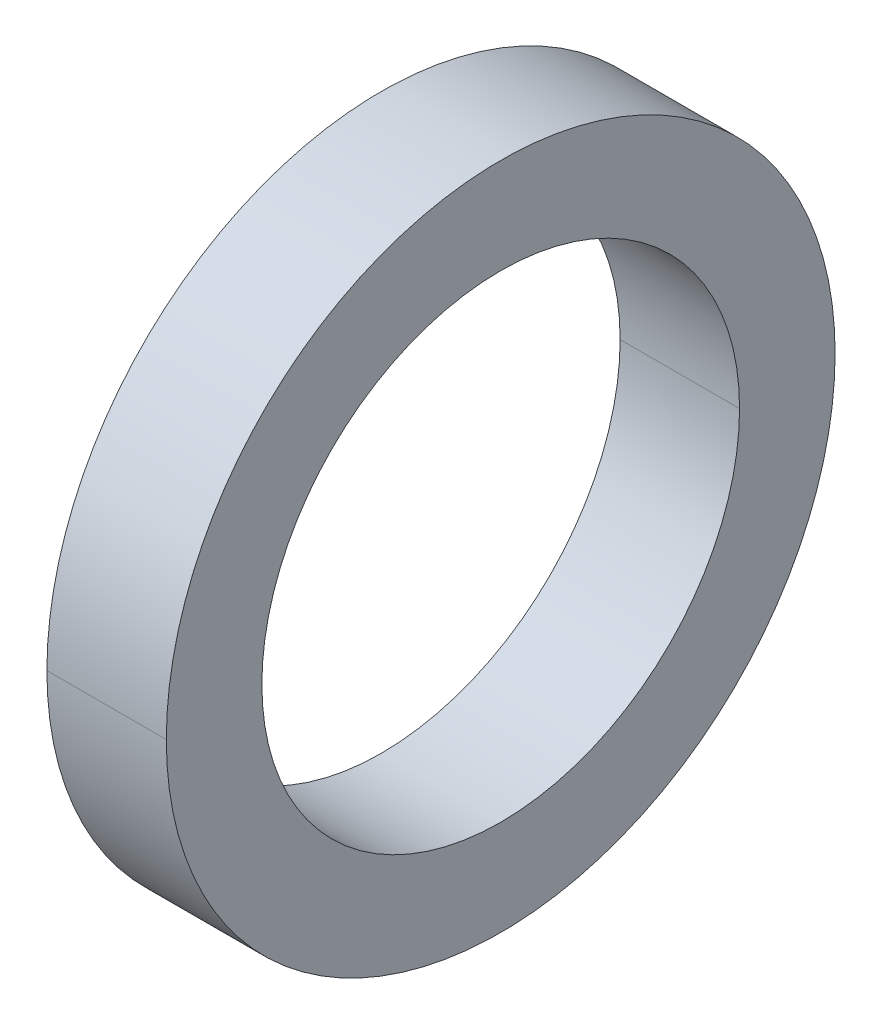
ISO-10303-21;
HEADER;
FILE_DESCRIPTION(('STEP AP214'),'2;1');
FILE_NAME('part.step','',(''),(''),'','','');
FILE_SCHEMA(('AUTOMOTIVE_DESIGN { 1 0 10303 214 1 1 1 1 }'));
ENDSEC;
DATA;
#1=APPLICATION_CONTEXT('core data for automotive mechanical design processes');
#2=APPLICATION_PROTOCOL_DEFINITION('international standard','automotive_design',2000,#1);
#3=PRODUCT_CONTEXT('',#1,'mechanical');
#4=PRODUCT('Part','Part','',(#3));
#5=PRODUCT_RELATED_PRODUCT_CATEGORY('part','',(#4));
#6=PRODUCT_DEFINITION_FORMATION('','',#4);
#7=PRODUCT_DEFINITION_CONTEXT('part definition',#1,'design');
#8=PRODUCT_DEFINITION('design','',#6,#7);
#9=PRODUCT_DEFINITION_SHAPE('','',#8);
#10=(LENGTH_UNIT() NAMED_UNIT(*) SI_UNIT(.MILLI.,.METRE.));
#11=(NAMED_UNIT(*) PLANE_ANGLE_UNIT() SI_UNIT($,.RADIAN.));
#12=(NAMED_UNIT(*) SI_UNIT($,.STERADIAN.) SOLID_ANGLE_UNIT());
#13=UNCERTAINTY_MEASURE_WITH_UNIT(LENGTH_MEASURE(1.E-05),#10,'distance_accuracy_value','');
#14=(GEOMETRIC_REPRESENTATION_CONTEXT(3) GLOBAL_UNCERTAINTY_ASSIGNED_CONTEXT((#13)) GLOBAL_UNIT_ASSIGNED_CONTEXT((#10,
#11,#12)) REPRESENTATION_CONTEXT('',''));
#15=CARTESIAN_POINT('',(0.,0.,0.));
#16=DIRECTION('',(0.,0.,1.));
#17=DIRECTION('',(1.,0.,0.));
#18=AXIS2_PLACEMENT_3D('',#15,#16,#17);
#19=CARTESIAN_POINT('',(-53.8652215327611,0.,0.));
#20=DIRECTION('',(-1.,0.,0.));
#21=DIRECTION('',(0.,0.,1.));
#22=AXIS2_PLACEMENT_3D('',#19,#20,#21);
#23=CYLINDRICAL_SURFACE('',#22,14.);
#24=CARTESIAN_POINT('',(-20.5,0.,0.));
#25=DIRECTION('',(-1.,0.,0.));
#26=DIRECTION('',(0.,0.,1.));
#27=AXIS2_PLACEMENT_3D('',#24,#25,#26);
#28=CIRCLE('',#27,14.);
#29=CARTESIAN_POINT('',(-20.5,0.,14.));
#30=VERTEX_POINT('',#29);
#31=CARTESIAN_POINT('',(-20.5,0.,-14.));
#32=VERTEX_POINT('',#31);
#33=EDGE_CURVE('E20',#30,#32,#28,.T.);
#34=ORIENTED_EDGE('',*,*,#33,.T.);
#35=DIRECTION('',(-1.,0.,0.));
#36=VECTOR('',#35,1.);
#37=CARTESIAN_POINT('',(-53.8652215327611,0.,-14.));
#38=LINE('',#37,#36);
#39=CARTESIAN_POINT('',(-25.5,0.,-14.));
#40=VERTEX_POINT('',#39);
#41=EDGE_CURVE('E81',#32,#40,#38,.T.);
#42=ORIENTED_EDGE('',*,*,#41,.T.);
#43=CARTESIAN_POINT('',(-25.5,0.,0.));
#44=DIRECTION('',(-1.,0.,0.));
#45=DIRECTION('',(0.,0.,1.));
#46=AXIS2_PLACEMENT_3D('',#43,#44,#45);
#47=CIRCLE('',#46,14.);
#48=CARTESIAN_POINT('',(-25.5,0.,14.));
#49=VERTEX_POINT('',#48);
#50=EDGE_CURVE('E27',#49,#40,#47,.T.);
#51=ORIENTED_EDGE('',*,*,#50,.F.);
#52=DIRECTION('',(-1.,0.,0.));
#53=VECTOR('',#52,1.);
#54=CARTESIAN_POINT('',(-53.8652215327611,0.,14.));
#55=LINE('',#54,#53);
#56=EDGE_CURVE('E75',#30,#49,#55,.T.);
#57=ORIENTED_EDGE('',*,*,#56,.F.);
#58=EDGE_LOOP('',(#34,#42,#51,#57));
#59=FACE_BOUND('',#58,.T.);
#60=ADVANCED_FACE('F16',(#59),#23,.T.);
#61=CARTESIAN_POINT('',(-53.8652215327611,0.,0.));
#62=DIRECTION('',(-1.,0.,0.));
#63=DIRECTION('',(0.,0.,1.));
#64=AXIS2_PLACEMENT_3D('',#61,#62,#63);
#65=CYLINDRICAL_SURFACE('',#64,10.);
#66=CARTESIAN_POINT('',(-20.5,0.,0.));
#67=DIRECTION('',(-1.,0.,0.));
#68=DIRECTION('',(0.,0.,1.));
#69=AXIS2_PLACEMENT_3D('',#66,#67,#68);
#70=CIRCLE('',#69,10.);
#71=CARTESIAN_POINT('',(-20.5,0.,-10.));
#72=VERTEX_POINT('',#71);
#73=CARTESIAN_POINT('',(-20.5,0.,10.));
#74=VERTEX_POINT('',#73);
#75=EDGE_CURVE('E92',#72,#74,#70,.T.);
#76=ORIENTED_EDGE('',*,*,#75,.F.);
#77=DIRECTION('',(-1.,0.,0.));
#78=VECTOR('',#77,1.);
#79=CARTESIAN_POINT('',(-53.8652215327611,0.,-10.));
#80=LINE('',#79,#78);
#81=CARTESIAN_POINT('',(-25.5,0.,-10.));
#82=VERTEX_POINT('',#81);
#83=EDGE_CURVE('E103',#72,#82,#80,.T.);
#84=ORIENTED_EDGE('',*,*,#83,.T.);
#85=CARTESIAN_POINT('',(-25.5,0.,0.));
#86=DIRECTION('',(-1.,0.,0.));
#87=DIRECTION('',(0.,0.,1.));
#88=AXIS2_PLACEMENT_3D('',#85,#86,#87);
#89=CIRCLE('',#88,10.);
#90=CARTESIAN_POINT('',(-25.5,0.,10.));
#91=VERTEX_POINT('',#90);
#92=EDGE_CURVE('E10',#82,#91,#89,.T.);
#93=ORIENTED_EDGE('',*,*,#92,.T.);
#94=DIRECTION('',(-1.,0.,0.));
#95=VECTOR('',#94,1.);
#96=CARTESIAN_POINT('',(-53.8652215327611,0.,10.));
#97=LINE('',#96,#95);
#98=EDGE_CURVE('E99',#74,#91,#97,.T.);
#99=ORIENTED_EDGE('',*,*,#98,.F.);
#100=EDGE_LOOP('',(#76,#84,#93,#99));
#101=FACE_BOUND('',#100,.T.);
#102=ADVANCED_FACE('F123',(#101),#65,.F.);
#103=CARTESIAN_POINT('',(-25.5,14.,0.));
#104=DIRECTION('',(1.,0.,0.));
#105=DIRECTION('',(0.,1.,0.));
#106=AXIS2_PLACEMENT_3D('',#103,#104,#105);
#107=PLANE('',#106);
#108=CARTESIAN_POINT('',(-25.5,0.,0.));
#109=DIRECTION('',(-1.,0.,0.));
#110=DIRECTION('',(0.,0.,1.));
#111=AXIS2_PLACEMENT_3D('',#108,#109,#110);
#112=CIRCLE('',#111,10.);
#113=EDGE_CURVE('E95',#91,#82,#112,.T.);
#114=ORIENTED_EDGE('',*,*,#113,.F.);
#115=ORIENTED_EDGE('',*,*,#92,.F.);
#116=EDGE_LOOP('',(#114,#115));
#117=FACE_BOUND('',#116,.T.);
#118=ORIENTED_EDGE('',*,*,#50,.T.);
#119=CARTESIAN_POINT('',(-25.5,0.,0.));
#120=DIRECTION('',(-1.,0.,0.));
#121=DIRECTION('',(0.,0.,1.));
#122=AXIS2_PLACEMENT_3D('',#119,#120,#121);
#123=CIRCLE('',#122,14.);
#124=EDGE_CURVE('E73',#40,#49,#123,.T.);
#125=ORIENTED_EDGE('',*,*,#124,.T.);
#126=EDGE_LOOP('',(#118,#125));
#127=FACE_BOUND('',#126,.T.);
#128=ADVANCED_FACE('F125',(#117,#127),#107,.F.);
#129=CARTESIAN_POINT('',(-53.8652215327611,0.,0.));
#130=DIRECTION('',(-1.,0.,0.));
#131=DIRECTION('',(0.,0.,1.));
#132=AXIS2_PLACEMENT_3D('',#129,#130,#131);
#133=CYLINDRICAL_SURFACE('',#132,10.);
#134=ORIENTED_EDGE('',*,*,#83,.F.);
#135=CARTESIAN_POINT('',(-20.5,0.,0.));
#136=DIRECTION('',(-1.,0.,0.));
#137=DIRECTION('',(0.,0.,1.));
#138=AXIS2_PLACEMENT_3D('',#135,#136,#137);
#139=CIRCLE('',#138,10.);
#140=EDGE_CURVE('E72',#74,#72,#139,.T.);
#141=ORIENTED_EDGE('',*,*,#140,.F.);
#142=ORIENTED_EDGE('',*,*,#98,.T.);
#143=ORIENTED_EDGE('',*,*,#113,.T.);
#144=EDGE_LOOP('',(#134,#141,#142,#143));
#145=FACE_BOUND('',#144,.T.);
#146=ADVANCED_FACE('F122',(#145),#133,.F.);
#147=CARTESIAN_POINT('',(-20.5,14.,0.));
#148=DIRECTION('',(-1.,0.,0.));
#149=DIRECTION('',(0.,0.,1.));
#150=AXIS2_PLACEMENT_3D('',#147,#148,#149);
#151=PLANE('',#150);
#152=ORIENTED_EDGE('',*,*,#140,.T.);
#153=ORIENTED_EDGE('',*,*,#75,.T.);
#154=EDGE_LOOP('',(#152,#153));
#155=FACE_BOUND('',#154,.T.);
#156=ORIENTED_EDGE('',*,*,#33,.F.);
#157=CARTESIAN_POINT('',(-20.5,0.,0.));
#158=DIRECTION('',(-1.,0.,0.));
#159=DIRECTION('',(0.,0.,1.));
#160=AXIS2_PLACEMENT_3D('',#157,#158,#159);
#161=CIRCLE('',#160,14.);
#162=EDGE_CURVE('E69',#32,#30,#161,.T.);
#163=ORIENTED_EDGE('',*,*,#162,.F.);
#164=EDGE_LOOP('',(#156,#163));
#165=FACE_BOUND('',#164,.T.);
#166=ADVANCED_FACE('F18',(#155,#165),#151,.F.);
#167=CARTESIAN_POINT('',(-53.8652215327611,0.,0.));
#168=DIRECTION('',(-1.,0.,0.));
#169=DIRECTION('',(0.,0.,1.));
#170=AXIS2_PLACEMENT_3D('',#167,#168,#169);
#171=CYLINDRICAL_SURFACE('',#170,14.);
#172=ORIENTED_EDGE('',*,*,#41,.F.);
#173=ORIENTED_EDGE('',*,*,#162,.T.);
#174=ORIENTED_EDGE('',*,*,#56,.T.);
#175=ORIENTED_EDGE('',*,*,#124,.F.);
#176=EDGE_LOOP('',(#172,#173,#174,#175));
#177=FACE_BOUND('',#176,.T.);
#178=ADVANCED_FACE('F80',(#177),#171,.T.);
#179=CLOSED_SHELL('',(#60,#102,#128,#146,#166,#178));
#180=MANIFOLD_SOLID_BREP('B1',#179);
#181=ADVANCED_BREP_SHAPE_REPRESENTATION('',(#18,#180),#14);
#182=SHAPE_DEFINITION_REPRESENTATION(#9,#181);
ENDSEC;
END-ISO-10303-21;
